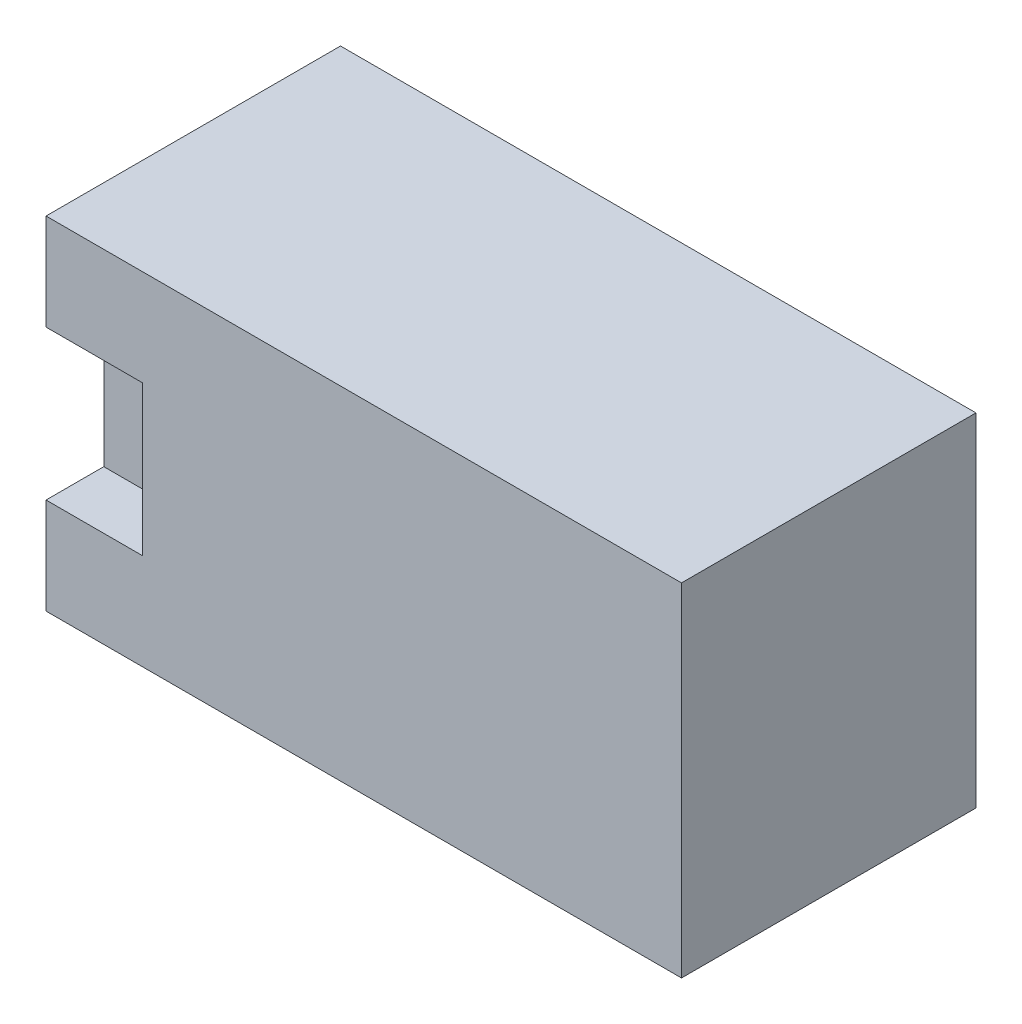
ISO-10303-21;
HEADER;
FILE_DESCRIPTION(('STEP AP214'),'2;1');
FILE_NAME('part.step','',(''),(''),'','','');
FILE_SCHEMA(('AUTOMOTIVE_DESIGN { 1 0 10303 214 1 1 1 1 }'));
ENDSEC;
DATA;
#1=APPLICATION_CONTEXT('core data for automotive mechanical design processes');
#2=APPLICATION_PROTOCOL_DEFINITION('international standard','automotive_design',2000,#1);
#3=PRODUCT_CONTEXT('',#1,'mechanical');
#4=PRODUCT('Part','Part','',(#3));
#5=PRODUCT_RELATED_PRODUCT_CATEGORY('part','',(#4));
#6=PRODUCT_DEFINITION_FORMATION('','',#4);
#7=PRODUCT_DEFINITION_CONTEXT('part definition',#1,'design');
#8=PRODUCT_DEFINITION('design','',#6,#7);
#9=PRODUCT_DEFINITION_SHAPE('','',#8);
#10=(LENGTH_UNIT() NAMED_UNIT(*) SI_UNIT(.MILLI.,.METRE.));
#11=(NAMED_UNIT(*) PLANE_ANGLE_UNIT() SI_UNIT($,.RADIAN.));
#12=(NAMED_UNIT(*) SI_UNIT($,.STERADIAN.) SOLID_ANGLE_UNIT());
#13=UNCERTAINTY_MEASURE_WITH_UNIT(LENGTH_MEASURE(1.E-05),#10,'distance_accuracy_value','');
#14=(GEOMETRIC_REPRESENTATION_CONTEXT(3) GLOBAL_UNCERTAINTY_ASSIGNED_CONTEXT((#13)) GLOBAL_UNIT_ASSIGNED_CONTEXT((#10,
#11,#12)) REPRESENTATION_CONTEXT('',''));
#15=CARTESIAN_POINT('',(0.,0.,0.));
#16=DIRECTION('',(0.,0.,1.));
#17=DIRECTION('',(1.,0.,0.));
#18=AXIS2_PLACEMENT_3D('',#15,#16,#17);
#19=CARTESIAN_POINT('',(-83.92840143684,14.7117487306658,15.3));
#20=DIRECTION('',(1.,0.,0.));
#21=DIRECTION('',(0.,0.,-1.));
#22=AXIS2_PLACEMENT_3D('',#19,#20,#21);
#23=PLANE('',#22);
#24=DIRECTION('',(0.,-1.,0.));
#25=VECTOR('',#24,1.);
#26=CARTESIAN_POINT('',(-83.92840143684,9.71174873066584,12.3));
#27=LINE('',#26,#25);
#28=CARTESIAN_POINT('',(-83.92840143684,9.71174873066584,12.3));
#29=VERTEX_POINT('',#28);
#30=CARTESIAN_POINT('',(-83.92840143684,1.93174873066584,12.3));
#31=VERTEX_POINT('',#30);
#32=EDGE_CURVE('E112',#29,#31,#27,.T.);
#33=ORIENTED_EDGE('',*,*,#32,.F.);
#34=DIRECTION('',(0.,0.,-1.));
#35=VECTOR('',#34,1.);
#36=CARTESIAN_POINT('',(-83.92840143684,9.71174873066584,12.3));
#37=LINE('',#36,#35);
#38=CARTESIAN_POINT('',(-83.92840143684,9.71174873066584,15.3));
#39=VERTEX_POINT('',#38);
#40=EDGE_CURVE('E124',#39,#29,#37,.T.);
#41=ORIENTED_EDGE('',*,*,#40,.F.);
#42=DIRECTION('',(0.,-1.,0.));
#43=VECTOR('',#42,1.);
#44=CARTESIAN_POINT('',(-83.92840143684,14.7117487306658,15.3));
#45=LINE('',#44,#43);
#46=CARTESIAN_POINT('',(-83.92840143684,14.7117487306658,15.3));
#47=VERTEX_POINT('',#46);
#48=EDGE_CURVE('E140',#47,#39,#45,.T.);
#49=ORIENTED_EDGE('',*,*,#48,.F.);
#50=DIRECTION('',(0.,0.,-1.));
#51=VECTOR('',#50,1.);
#52=CARTESIAN_POINT('',(-83.92840143684,14.7117487306658,15.3));
#53=LINE('',#52,#51);
#54=CARTESIAN_POINT('',(-83.92840143684,14.7117487306658,0.));
#55=VERTEX_POINT('',#54);
#56=EDGE_CURVE('E147',#47,#55,#53,.T.);
#57=ORIENTED_EDGE('',*,*,#56,.T.);
#58=DIRECTION('',(0.,-1.,0.));
#59=VECTOR('',#58,1.);
#60=CARTESIAN_POINT('',(-83.92840143684,14.7117487306658,0.));
#61=LINE('',#60,#59);
#62=CARTESIAN_POINT('',(-83.92840143684,-3.06825126933416,0.));
#63=VERTEX_POINT('',#62);
#64=EDGE_CURVE('E136',#55,#63,#61,.T.);
#65=ORIENTED_EDGE('',*,*,#64,.T.);
#66=DIRECTION('',(0.,0.,-1.));
#67=VECTOR('',#66,1.);
#68=CARTESIAN_POINT('',(-83.92840143684,-3.06825126933416,15.3));
#69=LINE('',#68,#67);
#70=CARTESIAN_POINT('',(-83.92840143684,-3.06825126933416,15.3));
#71=VERTEX_POINT('',#70);
#72=EDGE_CURVE('E11',#71,#63,#69,.T.);
#73=ORIENTED_EDGE('',*,*,#72,.F.);
#74=CARTESIAN_POINT('',(-83.92840143684,1.93174873066584,15.3));
#75=VERTEX_POINT('',#74);
#76=EDGE_CURVE('E83',#75,#71,#45,.T.);
#77=ORIENTED_EDGE('',*,*,#76,.F.);
#78=DIRECTION('',(0.,0.,1.));
#79=VECTOR('',#78,1.);
#80=CARTESIAN_POINT('',(-83.92840143684,1.93174873066584,12.3));
#81=LINE('',#80,#79);
#82=EDGE_CURVE('E127',#31,#75,#81,.T.);
#83=ORIENTED_EDGE('',*,*,#82,.F.);
#84=EDGE_LOOP('',(#33,#41,#49,#57,#65,#73,#77,#83));
#85=FACE_BOUND('',#84,.T.);
#86=ADVANCED_FACE('F32',(#85),#23,.F.);
#87=CARTESIAN_POINT('',(-83.92840143684,-3.06825126933416,15.3));
#88=DIRECTION('',(0.,1.,0.));
#89=DIRECTION('',(0.,0.,1.));
#90=AXIS2_PLACEMENT_3D('',#87,#88,#89);
#91=PLANE('',#90);
#92=DIRECTION('',(1.,0.,0.));
#93=VECTOR('',#92,1.);
#94=CARTESIAN_POINT('',(-83.92840143684,-3.06825126933416,0.));
#95=LINE('',#94,#93);
#96=CARTESIAN_POINT('',(-50.9084014368401,-3.06825126933416,0.));
#97=VERTEX_POINT('',#96);
#98=EDGE_CURVE('E150',#63,#97,#95,.T.);
#99=ORIENTED_EDGE('',*,*,#98,.T.);
#100=DIRECTION('',(0.,0.,-1.));
#101=VECTOR('',#100,1.);
#102=CARTESIAN_POINT('',(-50.9084014368401,-3.06825126933416,15.3));
#103=LINE('',#102,#101);
#104=CARTESIAN_POINT('',(-50.9084014368401,-3.06825126933416,15.3));
#105=VERTEX_POINT('',#104);
#106=EDGE_CURVE('E39',#105,#97,#103,.T.);
#107=ORIENTED_EDGE('',*,*,#106,.F.);
#108=DIRECTION('',(1.,0.,0.));
#109=VECTOR('',#108,1.);
#110=CARTESIAN_POINT('',(-83.92840143684,-3.06825126933416,15.3));
#111=LINE('',#110,#109);
#112=EDGE_CURVE('E142',#71,#105,#111,.T.);
#113=ORIENTED_EDGE('',*,*,#112,.F.);
#114=ORIENTED_EDGE('',*,*,#72,.T.);
#115=EDGE_LOOP('',(#99,#107,#113,#114));
#116=FACE_BOUND('',#115,.T.);
#117=ADVANCED_FACE('F181',(#116),#91,.F.);
#118=CARTESIAN_POINT('',(-50.9084014368401,14.7117487306658,15.3));
#119=DIRECTION('',(-1.,0.,0.));
#120=DIRECTION('',(0.,0.,1.));
#121=AXIS2_PLACEMENT_3D('',#118,#119,#120);
#122=PLANE('',#121);
#123=DIRECTION('',(0.,1.,0.));
#124=VECTOR('',#123,1.);
#125=CARTESIAN_POINT('',(-50.9084014368401,14.7117487306658,0.));
#126=LINE('',#125,#124);
#127=CARTESIAN_POINT('',(-50.9084014368401,14.7117487306658,0.));
#128=VERTEX_POINT('',#127);
#129=EDGE_CURVE('E152',#97,#128,#126,.T.);
#130=ORIENTED_EDGE('',*,*,#129,.T.);
#131=DIRECTION('',(0.,0.,-1.));
#132=VECTOR('',#131,1.);
#133=CARTESIAN_POINT('',(-50.9084014368401,14.7117487306658,15.3));
#134=LINE('',#133,#132);
#135=CARTESIAN_POINT('',(-50.9084014368401,14.7117487306658,15.3));
#136=VERTEX_POINT('',#135);
#137=EDGE_CURVE('E156',#136,#128,#134,.T.);
#138=ORIENTED_EDGE('',*,*,#137,.F.);
#139=DIRECTION('',(0.,1.,0.));
#140=VECTOR('',#139,1.);
#141=CARTESIAN_POINT('',(-50.9084014368401,14.7117487306658,15.3));
#142=LINE('',#141,#140);
#143=EDGE_CURVE('E144',#105,#136,#142,.T.);
#144=ORIENTED_EDGE('',*,*,#143,.F.);
#145=ORIENTED_EDGE('',*,*,#106,.T.);
#146=EDGE_LOOP('',(#130,#138,#144,#145));
#147=FACE_BOUND('',#146,.T.);
#148=ADVANCED_FACE('F162',(#147),#122,.F.);
#149=CARTESIAN_POINT('',(-83.92840143684,14.7117487306658,15.3));
#150=DIRECTION('',(0.,-1.,0.));
#151=DIRECTION('',(0.,0.,-1.));
#152=AXIS2_PLACEMENT_3D('',#149,#150,#151);
#153=PLANE('',#152);
#154=DIRECTION('',(-1.,0.,0.));
#155=VECTOR('',#154,1.);
#156=CARTESIAN_POINT('',(-83.92840143684,14.7117487306658,0.));
#157=LINE('',#156,#155);
#158=EDGE_CURVE('E76',#128,#55,#157,.T.);
#159=ORIENTED_EDGE('',*,*,#158,.T.);
#160=ORIENTED_EDGE('',*,*,#56,.F.);
#161=DIRECTION('',(-1.,0.,0.));
#162=VECTOR('',#161,1.);
#163=CARTESIAN_POINT('',(-83.92840143684,14.7117487306658,15.3));
#164=LINE('',#163,#162);
#165=EDGE_CURVE('E55',#136,#47,#164,.T.);
#166=ORIENTED_EDGE('',*,*,#165,.F.);
#167=ORIENTED_EDGE('',*,*,#137,.T.);
#168=EDGE_LOOP('',(#159,#160,#166,#167));
#169=FACE_BOUND('',#168,.T.);
#170=ADVANCED_FACE('F172',(#169),#153,.F.);
#171=CARTESIAN_POINT('',(0.,0.,15.3));
#172=DIRECTION('',(0.,0.,1.));
#173=DIRECTION('',(1.,0.,0.));
#174=AXIS2_PLACEMENT_3D('',#171,#172,#173);
#175=PLANE('',#174);
#176=DIRECTION('',(-1.,0.,0.));
#177=VECTOR('',#176,1.);
#178=CARTESIAN_POINT('',(-78.92840143684,9.71174873066584,15.3));
#179=LINE('',#178,#177);
#180=CARTESIAN_POINT('',(-78.92840143684,9.71174873066584,15.3));
#181=VERTEX_POINT('',#180);
#182=EDGE_CURVE('E137',#181,#39,#179,.T.);
#183=ORIENTED_EDGE('',*,*,#182,.F.);
#184=DIRECTION('',(0.,1.,0.));
#185=VECTOR('',#184,1.);
#186=CARTESIAN_POINT('',(-78.92840143684,9.71174873066584,15.3));
#187=LINE('',#186,#185);
#188=CARTESIAN_POINT('',(-78.92840143684,1.93174873066584,15.3));
#189=VERTEX_POINT('',#188);
#190=EDGE_CURVE('E120',#189,#181,#187,.T.);
#191=ORIENTED_EDGE('',*,*,#190,.F.);
#192=DIRECTION('',(-1.,0.,0.));
#193=VECTOR('',#192,1.);
#194=CARTESIAN_POINT('',(-78.92840143684,1.93174873066584,15.3));
#195=LINE('',#194,#193);
#196=EDGE_CURVE('E115',#189,#75,#195,.T.);
#197=ORIENTED_EDGE('',*,*,#196,.T.);
#198=ORIENTED_EDGE('',*,*,#76,.T.);
#199=ORIENTED_EDGE('',*,*,#112,.T.);
#200=ORIENTED_EDGE('',*,*,#143,.T.);
#201=ORIENTED_EDGE('',*,*,#165,.T.);
#202=ORIENTED_EDGE('',*,*,#48,.T.);
#203=EDGE_LOOP('',(#183,#191,#197,#198,#199,#200,#201,#202));
#204=FACE_BOUND('',#203,.T.);
#205=ADVANCED_FACE('F174',(#204),#175,.T.);
#206=CARTESIAN_POINT('',(0.,0.,0.));
#207=DIRECTION('',(0.,0.,1.));
#208=DIRECTION('',(1.,0.,0.));
#209=AXIS2_PLACEMENT_3D('',#206,#207,#208);
#210=PLANE('',#209);
#211=ORIENTED_EDGE('',*,*,#64,.F.);
#212=ORIENTED_EDGE('',*,*,#158,.F.);
#213=ORIENTED_EDGE('',*,*,#129,.F.);
#214=ORIENTED_EDGE('',*,*,#98,.F.);
#215=EDGE_LOOP('',(#211,#212,#213,#214));
#216=FACE_BOUND('',#215,.T.);
#217=ADVANCED_FACE('F167',(#216),#210,.F.);
#218=CARTESIAN_POINT('',(-78.92840143684,9.71174873066584,12.3));
#219=DIRECTION('',(0.,0.,-1.));
#220=DIRECTION('',(0.,1.,0.));
#221=AXIS2_PLACEMENT_3D('',#218,#219,#220);
#222=PLANE('',#221);
#223=ORIENTED_EDGE('',*,*,#32,.T.);
#224=DIRECTION('',(-1.,0.,0.));
#225=VECTOR('',#224,1.);
#226=CARTESIAN_POINT('',(-78.92840143684,1.93174873066584,12.3));
#227=LINE('',#226,#225);
#228=CARTESIAN_POINT('',(-78.92840143684,1.93174873066584,12.3));
#229=VERTEX_POINT('',#228);
#230=EDGE_CURVE('E107',#229,#31,#227,.T.);
#231=ORIENTED_EDGE('',*,*,#230,.F.);
#232=DIRECTION('',(0.,-1.,0.));
#233=VECTOR('',#232,1.);
#234=CARTESIAN_POINT('',(-78.92840143684,9.71174873066584,12.3));
#235=LINE('',#234,#233);
#236=CARTESIAN_POINT('',(-78.92840143684,9.71174873066584,12.3));
#237=VERTEX_POINT('',#236);
#238=EDGE_CURVE('E109',#237,#229,#235,.T.);
#239=ORIENTED_EDGE('',*,*,#238,.F.);
#240=DIRECTION('',(-1.,0.,0.));
#241=VECTOR('',#240,1.);
#242=CARTESIAN_POINT('',(-78.92840143684,9.71174873066584,12.3));
#243=LINE('',#242,#241);
#244=EDGE_CURVE('E134',#237,#29,#243,.T.);
#245=ORIENTED_EDGE('',*,*,#244,.T.);
#246=EDGE_LOOP('',(#223,#231,#239,#245));
#247=FACE_BOUND('',#246,.T.);
#248=ADVANCED_FACE('F108',(#247),#222,.F.);
#249=CARTESIAN_POINT('',(-78.92840143684,9.71174873066584,12.3));
#250=DIRECTION('',(0.,1.,0.));
#251=DIRECTION('',(0.,0.,1.));
#252=AXIS2_PLACEMENT_3D('',#249,#250,#251);
#253=PLANE('',#252);
#254=ORIENTED_EDGE('',*,*,#40,.T.);
#255=ORIENTED_EDGE('',*,*,#244,.F.);
#256=DIRECTION('',(0.,0.,-1.));
#257=VECTOR('',#256,1.);
#258=CARTESIAN_POINT('',(-78.92840143684,9.71174873066584,12.3));
#259=LINE('',#258,#257);
#260=EDGE_CURVE('E116',#181,#237,#259,.T.);
#261=ORIENTED_EDGE('',*,*,#260,.F.);
#262=ORIENTED_EDGE('',*,*,#182,.T.);
#263=EDGE_LOOP('',(#254,#255,#261,#262));
#264=FACE_BOUND('',#263,.T.);
#265=ADVANCED_FACE('F192',(#264),#253,.F.);
#266=CARTESIAN_POINT('',(-78.92840143684,1.93174873066584,12.3));
#267=DIRECTION('',(0.,-1.,0.));
#268=DIRECTION('',(0.,0.,-1.));
#269=AXIS2_PLACEMENT_3D('',#266,#267,#268);
#270=PLANE('',#269);
#271=ORIENTED_EDGE('',*,*,#82,.T.);
#272=ORIENTED_EDGE('',*,*,#196,.F.);
#273=DIRECTION('',(0.,0.,1.));
#274=VECTOR('',#273,1.);
#275=CARTESIAN_POINT('',(-78.92840143684,1.93174873066584,12.3));
#276=LINE('',#275,#274);
#277=EDGE_CURVE('E46',#229,#189,#276,.T.);
#278=ORIENTED_EDGE('',*,*,#277,.F.);
#279=ORIENTED_EDGE('',*,*,#230,.T.);
#280=EDGE_LOOP('',(#271,#272,#278,#279));
#281=FACE_BOUND('',#280,.T.);
#282=ADVANCED_FACE('F118',(#281),#270,.F.);
#283=CARTESIAN_POINT('',(-78.92840143684,0.,0.));
#284=DIRECTION('',(-1.,0.,0.));
#285=DIRECTION('',(0.,0.,1.));
#286=AXIS2_PLACEMENT_3D('',#283,#284,#285);
#287=PLANE('',#286);
#288=ORIENTED_EDGE('',*,*,#238,.T.);
#289=ORIENTED_EDGE('',*,*,#277,.T.);
#290=ORIENTED_EDGE('',*,*,#190,.T.);
#291=ORIENTED_EDGE('',*,*,#260,.T.);
#292=EDGE_LOOP('',(#288,#289,#290,#291));
#293=FACE_BOUND('',#292,.T.);
#294=ADVANCED_FACE('F122',(#293),#287,.T.);
#295=CLOSED_SHELL('',(#86,#117,#148,#170,#205,#217,#248,#265,#282,#294));
#296=MANIFOLD_SOLID_BREP('B2',#295);
#297=ADVANCED_BREP_SHAPE_REPRESENTATION('',(#18,#296),#14);
#298=SHAPE_DEFINITION_REPRESENTATION(#9,#297);
ENDSEC;
END-ISO-10303-21;
